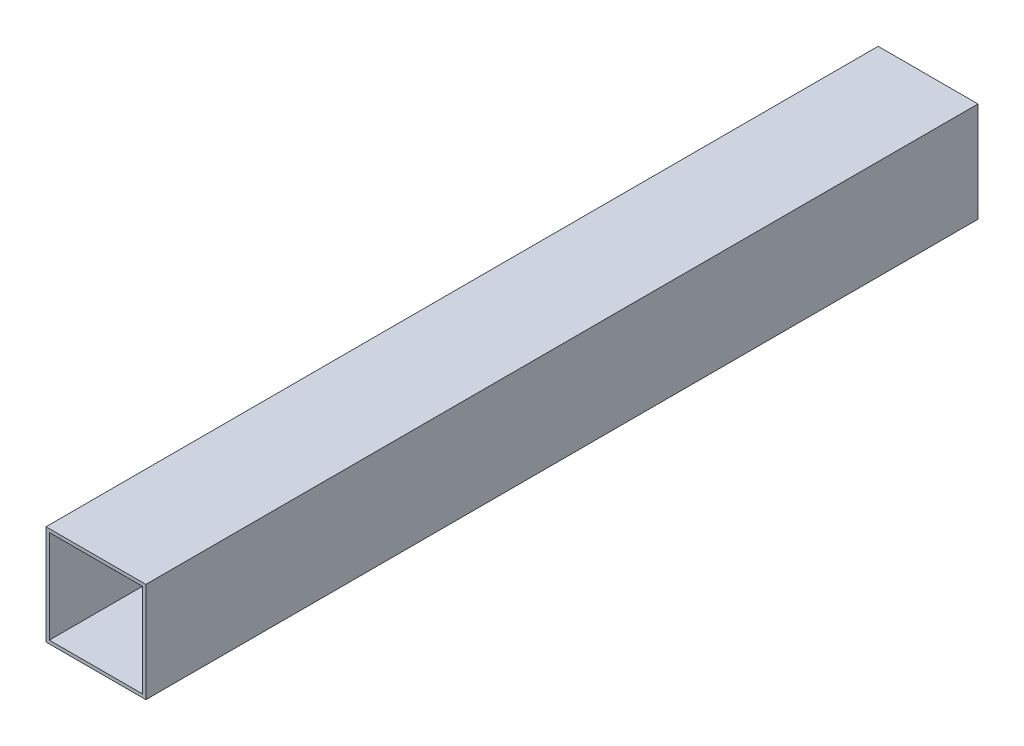
ISO-10303-21;
HEADER;
FILE_DESCRIPTION(('STEP AP214'),'2;1');
FILE_NAME('part.step','',(''),(''),'','','');
FILE_SCHEMA(('AUTOMOTIVE_DESIGN { 1 0 10303 214 1 1 1 1 }'));
ENDSEC;
DATA;
#1=APPLICATION_CONTEXT('core data for automotive mechanical design processes');
#2=APPLICATION_PROTOCOL_DEFINITION('international standard','automotive_design',2000,#1);
#3=PRODUCT_CONTEXT('',#1,'mechanical');
#4=PRODUCT('Part','Part','',(#3));
#5=PRODUCT_RELATED_PRODUCT_CATEGORY('part','',(#4));
#6=PRODUCT_DEFINITION_FORMATION('','',#4);
#7=PRODUCT_DEFINITION_CONTEXT('part definition',#1,'design');
#8=PRODUCT_DEFINITION('design','',#6,#7);
#9=PRODUCT_DEFINITION_SHAPE('','',#8);
#10=(LENGTH_UNIT() NAMED_UNIT(*) SI_UNIT(.MILLI.,.METRE.));
#11=(NAMED_UNIT(*) PLANE_ANGLE_UNIT() SI_UNIT($,.RADIAN.));
#12=(NAMED_UNIT(*) SI_UNIT($,.STERADIAN.) SOLID_ANGLE_UNIT());
#13=UNCERTAINTY_MEASURE_WITH_UNIT(LENGTH_MEASURE(1.E-05),#10,'distance_accuracy_value','');
#14=(GEOMETRIC_REPRESENTATION_CONTEXT(3) GLOBAL_UNCERTAINTY_ASSIGNED_CONTEXT((#13)) GLOBAL_UNIT_ASSIGNED_CONTEXT((#10,
#11,#12)) REPRESENTATION_CONTEXT('',''));
#15=CARTESIAN_POINT('',(0.,0.,0.));
#16=DIRECTION('',(0.,0.,1.));
#17=DIRECTION('',(1.,0.,0.));
#18=AXIS2_PLACEMENT_3D('',#15,#16,#17);
#19=CARTESIAN_POINT('',(-944.,-444.,0.));
#20=DIRECTION('',(-1.,0.,0.));
#21=DIRECTION('',(0.,0.,1.));
#22=AXIS2_PLACEMENT_3D('',#19,#20,#21);
#23=PLANE('',#22);
#24=DIRECTION('',(0.,-1.,0.));
#25=VECTOR('',#24,1.);
#26=CARTESIAN_POINT('',(-944.,-444.,500.));
#27=LINE('',#26,#25);
#28=CARTESIAN_POINT('',(-944.,-444.,500.));
#29=VERTEX_POINT('',#28);
#30=CARTESIAN_POINT('',(-944.,-500.,500.));
#31=VERTEX_POINT('',#30);
#32=EDGE_CURVE('E155',#29,#31,#27,.T.);
#33=ORIENTED_EDGE('',*,*,#32,.F.);
#34=DIRECTION('',(0.,0.,1.));
#35=VECTOR('',#34,1.);
#36=CARTESIAN_POINT('',(-944.,-444.,0.));
#37=LINE('',#36,#35);
#38=CARTESIAN_POINT('',(-944.,-444.,0.));
#39=VERTEX_POINT('',#38);
#40=EDGE_CURVE('E12',#39,#29,#37,.T.);
#41=ORIENTED_EDGE('',*,*,#40,.F.);
#42=DIRECTION('',(0.,-1.,0.));
#43=VECTOR('',#42,1.);
#44=CARTESIAN_POINT('',(-944.,-444.,0.));
#45=LINE('',#44,#43);
#46=CARTESIAN_POINT('',(-944.,-500.,0.));
#47=VERTEX_POINT('',#46);
#48=EDGE_CURVE('E119',#39,#47,#45,.T.);
#49=ORIENTED_EDGE('',*,*,#48,.T.);
#50=DIRECTION('',(0.,0.,1.));
#51=VECTOR('',#50,1.);
#52=CARTESIAN_POINT('',(-944.,-500.,0.));
#53=LINE('',#52,#51);
#54=EDGE_CURVE('E40',#47,#31,#53,.T.);
#55=ORIENTED_EDGE('',*,*,#54,.T.);
#56=EDGE_LOOP('',(#33,#41,#49,#55));
#57=FACE_BOUND('',#56,.T.);
#58=ADVANCED_FACE('F19',(#57),#23,.T.);
#59=CARTESIAN_POINT('',(-1000.,-444.,0.));
#60=DIRECTION('',(0.,-1.,0.));
#61=DIRECTION('',(0.,0.,-1.));
#62=AXIS2_PLACEMENT_3D('',#59,#60,#61);
#63=PLANE('',#62);
#64=DIRECTION('',(1.,0.,0.));
#65=VECTOR('',#64,1.);
#66=CARTESIAN_POINT('',(-1000.,-444.,500.));
#67=LINE('',#66,#65);
#68=CARTESIAN_POINT('',(-1000.,-444.,500.));
#69=VERTEX_POINT('',#68);
#70=EDGE_CURVE('E107',#69,#29,#67,.T.);
#71=ORIENTED_EDGE('',*,*,#70,.F.);
#72=DIRECTION('',(0.,0.,1.));
#73=VECTOR('',#72,1.);
#74=CARTESIAN_POINT('',(-1000.,-444.,0.));
#75=LINE('',#74,#73);
#76=CARTESIAN_POINT('',(-1000.,-444.,0.));
#77=VERTEX_POINT('',#76);
#78=EDGE_CURVE('E31',#77,#69,#75,.T.);
#79=ORIENTED_EDGE('',*,*,#78,.F.);
#80=DIRECTION('',(1.,0.,0.));
#81=VECTOR('',#80,1.);
#82=CARTESIAN_POINT('',(-1000.,-444.,0.));
#83=LINE('',#82,#81);
#84=EDGE_CURVE('E105',#77,#39,#83,.T.);
#85=ORIENTED_EDGE('',*,*,#84,.T.);
#86=ORIENTED_EDGE('',*,*,#40,.T.);
#87=EDGE_LOOP('',(#71,#79,#85,#86));
#88=FACE_BOUND('',#87,.T.);
#89=ADVANCED_FACE('F104',(#88),#63,.T.);
#90=CARTESIAN_POINT('',(-1000.,-444.,0.));
#91=DIRECTION('',(1.,0.,0.));
#92=DIRECTION('',(0.,0.,-1.));
#93=AXIS2_PLACEMENT_3D('',#90,#91,#92);
#94=PLANE('',#93);
#95=DIRECTION('',(0.,1.,0.));
#96=VECTOR('',#95,1.);
#97=CARTESIAN_POINT('',(-1000.,-444.,500.));
#98=LINE('',#97,#96);
#99=CARTESIAN_POINT('',(-1000.,-500.,500.));
#100=VERTEX_POINT('',#99);
#101=EDGE_CURVE('E166',#100,#69,#98,.T.);
#102=ORIENTED_EDGE('',*,*,#101,.F.);
#103=DIRECTION('',(0.,0.,1.));
#104=VECTOR('',#103,1.);
#105=CARTESIAN_POINT('',(-1000.,-500.,0.));
#106=LINE('',#105,#104);
#107=CARTESIAN_POINT('',(-1000.,-500.,0.));
#108=VERTEX_POINT('',#107);
#109=EDGE_CURVE('E73',#108,#100,#106,.T.);
#110=ORIENTED_EDGE('',*,*,#109,.F.);
#111=DIRECTION('',(0.,1.,0.));
#112=VECTOR('',#111,1.);
#113=CARTESIAN_POINT('',(-1000.,-444.,0.));
#114=LINE('',#113,#112);
#115=EDGE_CURVE('E118',#108,#77,#114,.T.);
#116=ORIENTED_EDGE('',*,*,#115,.T.);
#117=ORIENTED_EDGE('',*,*,#78,.T.);
#118=EDGE_LOOP('',(#102,#110,#116,#117));
#119=FACE_BOUND('',#118,.T.);
#120=ADVANCED_FACE('F122',(#119),#94,.T.);
#121=CARTESIAN_POINT('',(-942.,-442.,0.));
#122=DIRECTION('',(-1.,0.,0.));
#123=DIRECTION('',(0.,0.,1.));
#124=AXIS2_PLACEMENT_3D('',#121,#122,#123);
#125=PLANE('',#124);
#126=DIRECTION('',(0.,-1.,0.));
#127=VECTOR('',#126,1.);
#128=CARTESIAN_POINT('',(-942.,-442.,500.));
#129=LINE('',#128,#127);
#130=CARTESIAN_POINT('',(-942.,-442.,500.));
#131=VERTEX_POINT('',#130);
#132=CARTESIAN_POINT('',(-942.,-502.,500.));
#133=VERTEX_POINT('',#132);
#134=EDGE_CURVE('E134',#131,#133,#129,.T.);
#135=ORIENTED_EDGE('',*,*,#134,.T.);
#136=DIRECTION('',(0.,0.,1.));
#137=VECTOR('',#136,1.);
#138=CARTESIAN_POINT('',(-942.,-502.,0.));
#139=LINE('',#138,#137);
#140=CARTESIAN_POINT('',(-942.,-502.,0.));
#141=VERTEX_POINT('',#140);
#142=EDGE_CURVE('E24',#141,#133,#139,.T.);
#143=ORIENTED_EDGE('',*,*,#142,.F.);
#144=DIRECTION('',(0.,-1.,0.));
#145=VECTOR('',#144,1.);
#146=CARTESIAN_POINT('',(-942.,-442.,0.));
#147=LINE('',#146,#145);
#148=CARTESIAN_POINT('',(-942.,-442.,0.));
#149=VERTEX_POINT('',#148);
#150=EDGE_CURVE('E165',#149,#141,#147,.T.);
#151=ORIENTED_EDGE('',*,*,#150,.F.);
#152=DIRECTION('',(0.,0.,1.));
#153=VECTOR('',#152,1.);
#154=CARTESIAN_POINT('',(-942.,-442.,0.));
#155=LINE('',#154,#153);
#156=EDGE_CURVE('E130',#149,#131,#155,.T.);
#157=ORIENTED_EDGE('',*,*,#156,.T.);
#158=EDGE_LOOP('',(#135,#143,#151,#157));
#159=FACE_BOUND('',#158,.T.);
#160=ADVANCED_FACE('F22',(#159),#125,.F.);
#161=CARTESIAN_POINT('',(-1002.,-502.,0.));
#162=DIRECTION('',(0.,1.,0.));
#163=DIRECTION('',(0.,0.,1.));
#164=AXIS2_PLACEMENT_3D('',#161,#162,#163);
#165=PLANE('',#164);
#166=DIRECTION('',(-1.,0.,0.));
#167=VECTOR('',#166,1.);
#168=CARTESIAN_POINT('',(-1002.,-502.,500.));
#169=LINE('',#168,#167);
#170=CARTESIAN_POINT('',(-1002.,-502.,500.));
#171=VERTEX_POINT('',#170);
#172=EDGE_CURVE('E139',#133,#171,#169,.T.);
#173=ORIENTED_EDGE('',*,*,#172,.T.);
#174=DIRECTION('',(0.,0.,1.));
#175=VECTOR('',#174,1.);
#176=CARTESIAN_POINT('',(-1002.,-502.,0.));
#177=LINE('',#176,#175);
#178=CARTESIAN_POINT('',(-1002.,-502.,0.));
#179=VERTEX_POINT('',#178);
#180=EDGE_CURVE('E178',#179,#171,#177,.T.);
#181=ORIENTED_EDGE('',*,*,#180,.F.);
#182=DIRECTION('',(-1.,0.,0.));
#183=VECTOR('',#182,1.);
#184=CARTESIAN_POINT('',(-1002.,-502.,0.));
#185=LINE('',#184,#183);
#186=EDGE_CURVE('E87',#141,#179,#185,.T.);
#187=ORIENTED_EDGE('',*,*,#186,.F.);
#188=ORIENTED_EDGE('',*,*,#142,.T.);
#189=EDGE_LOOP('',(#173,#181,#187,#188));
#190=FACE_BOUND('',#189,.T.);
#191=ADVANCED_FACE('F188',(#190),#165,.F.);
#192=CARTESIAN_POINT('',(-1002.,-442.,0.));
#193=DIRECTION('',(1.,0.,0.));
#194=DIRECTION('',(0.,0.,-1.));
#195=AXIS2_PLACEMENT_3D('',#192,#193,#194);
#196=PLANE('',#195);
#197=DIRECTION('',(0.,1.,0.));
#198=VECTOR('',#197,1.);
#199=CARTESIAN_POINT('',(-1002.,-442.,500.));
#200=LINE('',#199,#198);
#201=CARTESIAN_POINT('',(-1002.,-442.,500.));
#202=VERTEX_POINT('',#201);
#203=EDGE_CURVE('E148',#171,#202,#200,.T.);
#204=ORIENTED_EDGE('',*,*,#203,.T.);
#205=DIRECTION('',(0.,0.,1.));
#206=VECTOR('',#205,1.);
#207=CARTESIAN_POINT('',(-1002.,-442.,0.));
#208=LINE('',#207,#206);
#209=CARTESIAN_POINT('',(-1002.,-442.,0.));
#210=VERTEX_POINT('',#209);
#211=EDGE_CURVE('E175',#210,#202,#208,.T.);
#212=ORIENTED_EDGE('',*,*,#211,.F.);
#213=DIRECTION('',(0.,1.,0.));
#214=VECTOR('',#213,1.);
#215=CARTESIAN_POINT('',(-1002.,-442.,0.));
#216=LINE('',#215,#214);
#217=EDGE_CURVE('E201',#179,#210,#216,.T.);
#218=ORIENTED_EDGE('',*,*,#217,.F.);
#219=ORIENTED_EDGE('',*,*,#180,.T.);
#220=EDGE_LOOP('',(#204,#212,#218,#219));
#221=FACE_BOUND('',#220,.T.);
#222=ADVANCED_FACE('F212',(#221),#196,.F.);
#223=CARTESIAN_POINT('',(-1002.,-442.,0.));
#224=DIRECTION('',(0.,-1.,0.));
#225=DIRECTION('',(0.,0.,-1.));
#226=AXIS2_PLACEMENT_3D('',#223,#224,#225);
#227=PLANE('',#226);
#228=DIRECTION('',(1.,0.,0.));
#229=VECTOR('',#228,1.);
#230=CARTESIAN_POINT('',(-1002.,-442.,500.));
#231=LINE('',#230,#229);
#232=EDGE_CURVE('E152',#202,#131,#231,.T.);
#233=ORIENTED_EDGE('',*,*,#232,.T.);
#234=ORIENTED_EDGE('',*,*,#156,.F.);
#235=DIRECTION('',(1.,0.,0.));
#236=VECTOR('',#235,1.);
#237=CARTESIAN_POINT('',(-1002.,-442.,0.));
#238=LINE('',#237,#236);
#239=EDGE_CURVE('E200',#210,#149,#238,.T.);
#240=ORIENTED_EDGE('',*,*,#239,.F.);
#241=ORIENTED_EDGE('',*,*,#211,.T.);
#242=EDGE_LOOP('',(#233,#234,#240,#241));
#243=FACE_BOUND('',#242,.T.);
#244=ADVANCED_FACE('F214',(#243),#227,.F.);
#245=CARTESIAN_POINT('',(-1000.,-500.,0.));
#246=DIRECTION('',(0.,1.,0.));
#247=DIRECTION('',(0.,0.,1.));
#248=AXIS2_PLACEMENT_3D('',#245,#246,#247);
#249=PLANE('',#248);
#250=DIRECTION('',(-1.,0.,0.));
#251=VECTOR('',#250,1.);
#252=CARTESIAN_POINT('',(-1000.,-500.,500.));
#253=LINE('',#252,#251);
#254=EDGE_CURVE('E160',#31,#100,#253,.T.);
#255=ORIENTED_EDGE('',*,*,#254,.F.);
#256=ORIENTED_EDGE('',*,*,#54,.F.);
#257=DIRECTION('',(-1.,0.,0.));
#258=VECTOR('',#257,1.);
#259=CARTESIAN_POINT('',(-1000.,-500.,0.));
#260=LINE('',#259,#258);
#261=EDGE_CURVE('E124',#47,#108,#260,.T.);
#262=ORIENTED_EDGE('',*,*,#261,.T.);
#263=ORIENTED_EDGE('',*,*,#109,.T.);
#264=EDGE_LOOP('',(#255,#256,#262,#263));
#265=FACE_BOUND('',#264,.T.);
#266=ADVANCED_FACE('F216',(#265),#249,.T.);
#267=CARTESIAN_POINT('',(-1972.,28.,0.));
#268=DIRECTION('',(0.,0.,1.));
#269=DIRECTION('',(1.,0.,0.));
#270=AXIS2_PLACEMENT_3D('',#267,#268,#269);
#271=PLANE('',#270);
#272=ORIENTED_EDGE('',*,*,#150,.T.);
#273=ORIENTED_EDGE('',*,*,#186,.T.);
#274=ORIENTED_EDGE('',*,*,#217,.T.);
#275=ORIENTED_EDGE('',*,*,#239,.T.);
#276=EDGE_LOOP('',(#272,#273,#274,#275));
#277=FACE_BOUND('',#276,.T.);
#278=ORIENTED_EDGE('',*,*,#48,.F.);
#279=ORIENTED_EDGE('',*,*,#84,.F.);
#280=ORIENTED_EDGE('',*,*,#115,.F.);
#281=ORIENTED_EDGE('',*,*,#261,.F.);
#282=EDGE_LOOP('',(#278,#279,#280,#281));
#283=FACE_BOUND('',#282,.T.);
#284=ADVANCED_FACE('F116',(#277,#283),#271,.F.);
#285=CARTESIAN_POINT('',(-1972.,28.,500.));
#286=DIRECTION('',(0.,0.,1.));
#287=DIRECTION('',(1.,0.,0.));
#288=AXIS2_PLACEMENT_3D('',#285,#286,#287);
#289=PLANE('',#288);
#290=ORIENTED_EDGE('',*,*,#134,.F.);
#291=ORIENTED_EDGE('',*,*,#232,.F.);
#292=ORIENTED_EDGE('',*,*,#203,.F.);
#293=ORIENTED_EDGE('',*,*,#172,.F.);
#294=EDGE_LOOP('',(#290,#291,#292,#293));
#295=FACE_BOUND('',#294,.T.);
#296=ORIENTED_EDGE('',*,*,#32,.T.);
#297=ORIENTED_EDGE('',*,*,#254,.T.);
#298=ORIENTED_EDGE('',*,*,#101,.T.);
#299=ORIENTED_EDGE('',*,*,#70,.T.);
#300=EDGE_LOOP('',(#296,#297,#298,#299));
#301=FACE_BOUND('',#300,.T.);
#302=ADVANCED_FACE('F195',(#295,#301),#289,.T.);
#303=CLOSED_SHELL('',(#58,#89,#120,#160,#191,#222,#244,#266,#284,#302));
#304=MANIFOLD_SOLID_BREP('B1',#303);
#305=ADVANCED_BREP_SHAPE_REPRESENTATION('',(#18,#304),#14);
#306=SHAPE_DEFINITION_REPRESENTATION(#9,#305);
ENDSEC;
END-ISO-10303-21;
